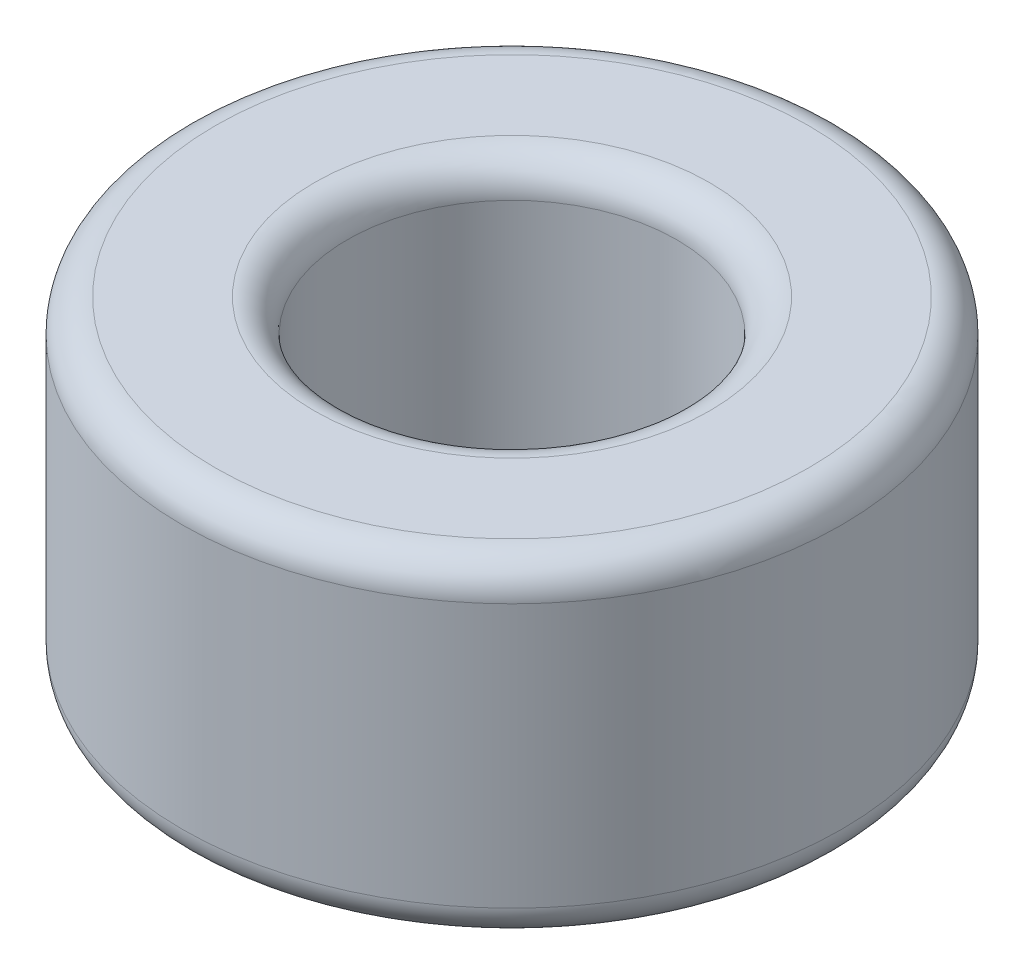
ISO-10303-21;
HEADER;
FILE_DESCRIPTION(('STEP AP214'),'2;1');
FILE_NAME('part.step','',(''),(''),'','','');
FILE_SCHEMA(('AUTOMOTIVE_DESIGN { 1 0 10303 214 1 1 1 1 }'));
ENDSEC;
DATA;
#1=APPLICATION_CONTEXT('core data for automotive mechanical design processes');
#2=APPLICATION_PROTOCOL_DEFINITION('international standard','automotive_design',2000,#1);
#3=PRODUCT_CONTEXT('',#1,'mechanical');
#4=PRODUCT('Part','Part','',(#3));
#5=PRODUCT_RELATED_PRODUCT_CATEGORY('part','',(#4));
#6=PRODUCT_DEFINITION_FORMATION('','',#4);
#7=PRODUCT_DEFINITION_CONTEXT('part definition',#1,'design');
#8=PRODUCT_DEFINITION('design','',#6,#7);
#9=PRODUCT_DEFINITION_SHAPE('','',#8);
#10=(LENGTH_UNIT() NAMED_UNIT(*) SI_UNIT(.MILLI.,.METRE.));
#11=(NAMED_UNIT(*) PLANE_ANGLE_UNIT() SI_UNIT($,.RADIAN.));
#12=(NAMED_UNIT(*) SI_UNIT($,.STERADIAN.) SOLID_ANGLE_UNIT());
#13=UNCERTAINTY_MEASURE_WITH_UNIT(LENGTH_MEASURE(1.E-05),#10,'distance_accuracy_value','');
#14=(GEOMETRIC_REPRESENTATION_CONTEXT(3) GLOBAL_UNCERTAINTY_ASSIGNED_CONTEXT((#13)) GLOBAL_UNIT_ASSIGNED_CONTEXT((#10,
#11,#12)) REPRESENTATION_CONTEXT('',''));
#15=CARTESIAN_POINT('',(0.,0.,0.));
#16=DIRECTION('',(0.,0.,1.));
#17=DIRECTION('',(1.,0.,0.));
#18=AXIS2_PLACEMENT_3D('',#15,#16,#17);
#19=CARTESIAN_POINT('',(0.,-2.,0.));
#20=DIRECTION('',(0.,1.,0.));
#21=DIRECTION('',(0.,0.,1.));
#22=AXIS2_PLACEMENT_3D('',#19,#20,#21);
#23=TOROIDAL_SURFACE('',#22,4.5,0.5);
#24=CARTESIAN_POINT('',(0.,-2.5,0.));
#25=DIRECTION('',(0.,1.,0.));
#26=DIRECTION('',(0.,0.,1.));
#27=AXIS2_PLACEMENT_3D('',#24,#25,#26);
#28=CIRCLE('',#27,4.5);
#29=CARTESIAN_POINT('',(0.,-2.5,4.5));
#30=VERTEX_POINT('',#29);
#31=EDGE_CURVE('E10',#30,#30,#28,.T.);
#32=ORIENTED_EDGE('',*,*,#31,.T.);
#33=EDGE_LOOP('',(#32));
#34=FACE_BOUND('',#33,.T.);
#35=CARTESIAN_POINT('',(0.,-2.,0.));
#36=DIRECTION('',(0.,1.,0.));
#37=DIRECTION('',(0.,0.,1.));
#38=AXIS2_PLACEMENT_3D('',#35,#36,#37);
#39=CIRCLE('',#38,5.);
#40=CARTESIAN_POINT('',(0.,-2.,5.));
#41=VERTEX_POINT('',#40);
#42=EDGE_CURVE('E65',#41,#41,#39,.T.);
#43=ORIENTED_EDGE('',*,*,#42,.F.);
#44=EDGE_LOOP('',(#43));
#45=FACE_BOUND('',#44,.T.);
#46=ADVANCED_FACE('F37',(#34,#45),#23,.T.);
#47=CARTESIAN_POINT('',(0.,-2.5,4.5));
#48=DIRECTION('',(0.,-1.,0.));
#49=DIRECTION('',(0.,0.,-1.));
#50=AXIS2_PLACEMENT_3D('',#47,#48,#49);
#51=PLANE('',#50);
#52=CARTESIAN_POINT('',(0.,-2.5,0.));
#53=DIRECTION('',(0.,1.,0.));
#54=DIRECTION('',(0.,0.,1.));
#55=AXIS2_PLACEMENT_3D('',#52,#53,#54);
#56=CIRCLE('',#55,3.);
#57=CARTESIAN_POINT('',(0.,-2.5,3.));
#58=VERTEX_POINT('',#57);
#59=EDGE_CURVE('E43',#58,#58,#56,.T.);
#60=ORIENTED_EDGE('',*,*,#59,.T.);
#61=EDGE_LOOP('',(#60));
#62=FACE_BOUND('',#61,.T.);
#63=ORIENTED_EDGE('',*,*,#31,.F.);
#64=EDGE_LOOP('',(#63));
#65=FACE_BOUND('',#64,.T.);
#66=ADVANCED_FACE('F73',(#62,#65),#51,.T.);
#67=CARTESIAN_POINT('',(0.,-2.,0.));
#68=DIRECTION('',(0.,1.,0.));
#69=DIRECTION('',(0.,0.,1.));
#70=AXIS2_PLACEMENT_3D('',#67,#68,#69);
#71=TOROIDAL_SURFACE('',#70,3.,0.5);
#72=CARTESIAN_POINT('',(0.,-2.,0.));
#73=DIRECTION('',(0.,1.,0.));
#74=DIRECTION('',(0.,0.,1.));
#75=AXIS2_PLACEMENT_3D('',#72,#73,#74);
#76=CIRCLE('',#75,2.5);
#77=CARTESIAN_POINT('',(0.,-2.,2.5));
#78=VERTEX_POINT('',#77);
#79=EDGE_CURVE('E47',#78,#78,#76,.T.);
#80=ORIENTED_EDGE('',*,*,#79,.T.);
#81=EDGE_LOOP('',(#80));
#82=FACE_BOUND('',#81,.T.);
#83=ORIENTED_EDGE('',*,*,#59,.F.);
#84=EDGE_LOOP('',(#83));
#85=FACE_BOUND('',#84,.T.);
#86=ADVANCED_FACE('F77',(#82,#85),#71,.T.);
#87=CARTESIAN_POINT('',(0.,0.,0.));
#88=DIRECTION('',(0.,1.,0.));
#89=DIRECTION('',(0.,0.,1.));
#90=AXIS2_PLACEMENT_3D('',#87,#88,#89);
#91=CYLINDRICAL_SURFACE('',#90,2.5);
#92=CARTESIAN_POINT('',(0.,2.,0.));
#93=DIRECTION('',(0.,1.,0.));
#94=DIRECTION('',(0.,0.,1.));
#95=AXIS2_PLACEMENT_3D('',#92,#93,#94);
#96=CIRCLE('',#95,2.5);
#97=CARTESIAN_POINT('',(0.,2.,2.5));
#98=VERTEX_POINT('',#97);
#99=EDGE_CURVE('E51',#98,#98,#96,.T.);
#100=ORIENTED_EDGE('',*,*,#99,.T.);
#101=EDGE_LOOP('',(#100));
#102=FACE_BOUND('',#101,.T.);
#103=ORIENTED_EDGE('',*,*,#79,.F.);
#104=EDGE_LOOP('',(#103));
#105=FACE_BOUND('',#104,.T.);
#106=ADVANCED_FACE('F81',(#102,#105),#91,.F.);
#107=CARTESIAN_POINT('',(0.,2.,0.));
#108=DIRECTION('',(0.,1.,0.));
#109=DIRECTION('',(0.,0.,1.));
#110=AXIS2_PLACEMENT_3D('',#107,#108,#109);
#111=TOROIDAL_SURFACE('',#110,3.,0.5);
#112=CARTESIAN_POINT('',(0.,2.5,0.));
#113=DIRECTION('',(0.,1.,0.));
#114=DIRECTION('',(0.,0.,1.));
#115=AXIS2_PLACEMENT_3D('',#112,#113,#114);
#116=CIRCLE('',#115,3.);
#117=CARTESIAN_POINT('',(0.,2.5,3.));
#118=VERTEX_POINT('',#117);
#119=EDGE_CURVE('E56',#118,#118,#116,.T.);
#120=ORIENTED_EDGE('',*,*,#119,.T.);
#121=EDGE_LOOP('',(#120));
#122=FACE_BOUND('',#121,.T.);
#123=ORIENTED_EDGE('',*,*,#99,.F.);
#124=EDGE_LOOP('',(#123));
#125=FACE_BOUND('',#124,.T.);
#126=ADVANCED_FACE('F88',(#122,#125),#111,.T.);
#127=CARTESIAN_POINT('',(0.,2.5,4.5));
#128=DIRECTION('',(0.,1.,0.));
#129=DIRECTION('',(0.,0.,1.));
#130=AXIS2_PLACEMENT_3D('',#127,#128,#129);
#131=PLANE('',#130);
#132=CARTESIAN_POINT('',(0.,2.5,0.));
#133=DIRECTION('',(0.,1.,0.));
#134=DIRECTION('',(0.,0.,1.));
#135=AXIS2_PLACEMENT_3D('',#132,#133,#134);
#136=CIRCLE('',#135,4.5);
#137=CARTESIAN_POINT('',(0.,2.5,4.5));
#138=VERTEX_POINT('',#137);
#139=EDGE_CURVE('E59',#138,#138,#136,.T.);
#140=ORIENTED_EDGE('',*,*,#139,.T.);
#141=EDGE_LOOP('',(#140));
#142=FACE_BOUND('',#141,.T.);
#143=ORIENTED_EDGE('',*,*,#119,.F.);
#144=EDGE_LOOP('',(#143));
#145=FACE_BOUND('',#144,.T.);
#146=ADVANCED_FACE('F92',(#142,#145),#131,.T.);
#147=CARTESIAN_POINT('',(0.,2.,0.));
#148=DIRECTION('',(0.,1.,0.));
#149=DIRECTION('',(0.,0.,1.));
#150=AXIS2_PLACEMENT_3D('',#147,#148,#149);
#151=TOROIDAL_SURFACE('',#150,4.5,0.5);
#152=CARTESIAN_POINT('',(0.,2.,0.));
#153=DIRECTION('',(0.,1.,0.));
#154=DIRECTION('',(0.,0.,1.));
#155=AXIS2_PLACEMENT_3D('',#152,#153,#154);
#156=CIRCLE('',#155,5.);
#157=CARTESIAN_POINT('',(0.,2.,5.));
#158=VERTEX_POINT('',#157);
#159=EDGE_CURVE('E62',#158,#158,#156,.T.);
#160=ORIENTED_EDGE('',*,*,#159,.T.);
#161=EDGE_LOOP('',(#160));
#162=FACE_BOUND('',#161,.T.);
#163=ORIENTED_EDGE('',*,*,#139,.F.);
#164=EDGE_LOOP('',(#163));
#165=FACE_BOUND('',#164,.T.);
#166=ADVANCED_FACE('F96',(#162,#165),#151,.T.);
#167=CARTESIAN_POINT('',(0.,0.,0.));
#168=DIRECTION('',(0.,1.,0.));
#169=DIRECTION('',(0.,0.,1.));
#170=AXIS2_PLACEMENT_3D('',#167,#168,#169);
#171=CYLINDRICAL_SURFACE('',#170,5.);
#172=ORIENTED_EDGE('',*,*,#42,.T.);
#173=EDGE_LOOP('',(#172));
#174=FACE_BOUND('',#173,.T.);
#175=ORIENTED_EDGE('',*,*,#159,.F.);
#176=EDGE_LOOP('',(#175));
#177=FACE_BOUND('',#176,.T.);
#178=ADVANCED_FACE('F69',(#174,#177),#171,.T.);
#179=CLOSED_SHELL('',(#46,#66,#86,#106,#126,#146,#166,#178));
#180=MANIFOLD_SOLID_BREP('B2',#179);
#181=ADVANCED_BREP_SHAPE_REPRESENTATION('',(#18,#180),#14);
#182=SHAPE_DEFINITION_REPRESENTATION(#9,#181);
ENDSEC;
END-ISO-10303-21;
